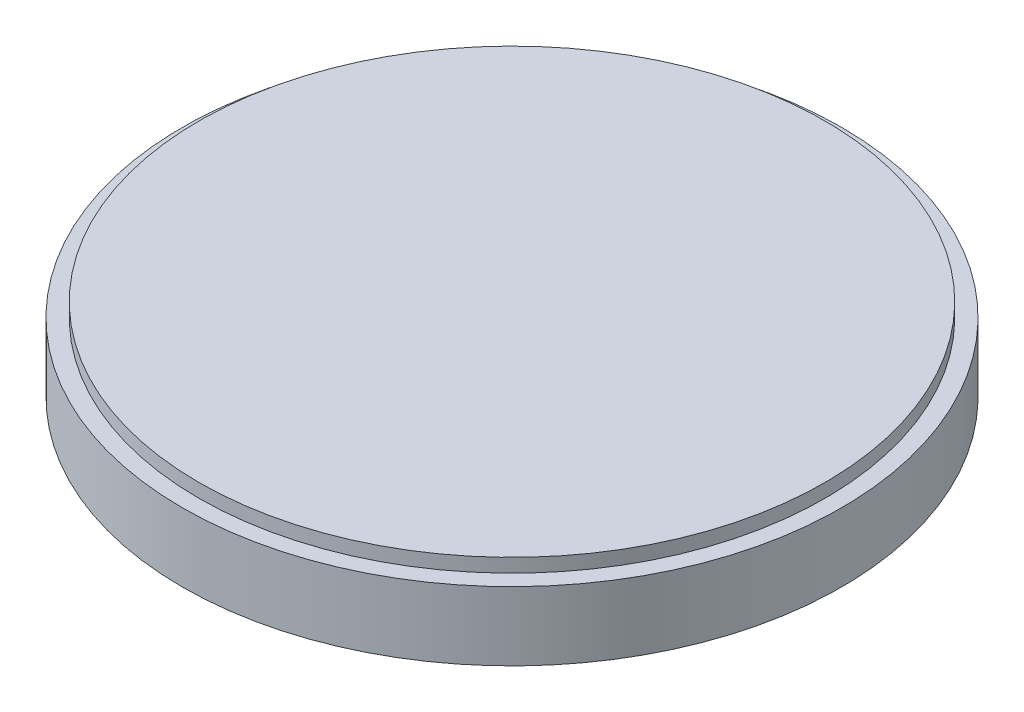
ISO-10303-21;
HEADER;
FILE_DESCRIPTION(('STEP AP214'),'2;1');
FILE_NAME('part.step','',(''),(''),'','','');
FILE_SCHEMA(('AUTOMOTIVE_DESIGN { 1 0 10303 214 1 1 1 1 }'));
ENDSEC;
DATA;
#1=APPLICATION_CONTEXT('core data for automotive mechanical design processes');
#2=APPLICATION_PROTOCOL_DEFINITION('international standard','automotive_design',2000,#1);
#3=PRODUCT_CONTEXT('',#1,'mechanical');
#4=PRODUCT('Part','Part','',(#3));
#5=PRODUCT_RELATED_PRODUCT_CATEGORY('part','',(#4));
#6=PRODUCT_DEFINITION_FORMATION('','',#4);
#7=PRODUCT_DEFINITION_CONTEXT('part definition',#1,'design');
#8=PRODUCT_DEFINITION('design','',#6,#7);
#9=PRODUCT_DEFINITION_SHAPE('','',#8);
#10=(LENGTH_UNIT() NAMED_UNIT(*) SI_UNIT(.MILLI.,.METRE.));
#11=(NAMED_UNIT(*) PLANE_ANGLE_UNIT() SI_UNIT($,.RADIAN.));
#12=(NAMED_UNIT(*) SI_UNIT($,.STERADIAN.) SOLID_ANGLE_UNIT());
#13=UNCERTAINTY_MEASURE_WITH_UNIT(LENGTH_MEASURE(1.E-05),#10,'distance_accuracy_value','');
#14=(GEOMETRIC_REPRESENTATION_CONTEXT(3) GLOBAL_UNCERTAINTY_ASSIGNED_CONTEXT((#13)) GLOBAL_UNIT_ASSIGNED_CONTEXT((#10,
#11,#12)) REPRESENTATION_CONTEXT('',''));
#15=CARTESIAN_POINT('',(0.,0.,0.));
#16=DIRECTION('',(0.,0.,1.));
#17=DIRECTION('',(1.,0.,0.));
#18=AXIS2_PLACEMENT_3D('',#15,#16,#17);
#19=CARTESIAN_POINT('',(0.,7.5,0.));
#20=DIRECTION('',(0.,-1.,0.));
#21=DIRECTION('',(0.,0.,-1.));
#22=AXIS2_PLACEMENT_3D('',#19,#20,#21);
#23=CYLINDRICAL_SURFACE('',#22,57.);
#24=CARTESIAN_POINT('',(0.,5.,0.));
#25=DIRECTION('',(0.,1.,0.));
#26=DIRECTION('',(0.,0.,1.));
#27=AXIS2_PLACEMENT_3D('',#24,#25,#26);
#28=CIRCLE('',#27,57.);
#29=CARTESIAN_POINT('',(0.,5.,57.));
#30=VERTEX_POINT('',#29);
#31=EDGE_CURVE('E41',#30,#30,#28,.T.);
#32=ORIENTED_EDGE('',*,*,#31,.T.);
#33=EDGE_LOOP('',(#32));
#34=FACE_BOUND('',#33,.T.);
#35=CARTESIAN_POINT('',(0.,7.5,0.));
#36=DIRECTION('',(0.,1.,0.));
#37=DIRECTION('',(0.,0.,1.));
#38=AXIS2_PLACEMENT_3D('',#35,#36,#37);
#39=CIRCLE('',#38,57.);
#40=CARTESIAN_POINT('',(0.,7.5,57.));
#41=VERTEX_POINT('',#40);
#42=EDGE_CURVE('E10',#41,#41,#39,.T.);
#43=ORIENTED_EDGE('',*,*,#42,.F.);
#44=EDGE_LOOP('',(#43));
#45=FACE_BOUND('',#44,.T.);
#46=ADVANCED_FACE('F31',(#34,#45),#23,.T.);
#47=CARTESIAN_POINT('',(0.,7.5,0.));
#48=DIRECTION('',(0.,1.,0.));
#49=DIRECTION('',(0.,0.,1.));
#50=AXIS2_PLACEMENT_3D('',#47,#48,#49);
#51=PLANE('',#50);
#52=ORIENTED_EDGE('',*,*,#42,.T.);
#53=EDGE_LOOP('',(#52));
#54=FACE_BOUND('',#53,.T.);
#55=ADVANCED_FACE('F62',(#54),#51,.T.);
#56=CARTESIAN_POINT('',(0.,5.,0.));
#57=DIRECTION('',(0.,1.,0.));
#58=DIRECTION('',(0.,0.,1.));
#59=AXIS2_PLACEMENT_3D('',#56,#57,#58);
#60=PLANE('',#59);
#61=CARTESIAN_POINT('',(0.,5.,0.));
#62=DIRECTION('',(0.,1.,0.));
#63=DIRECTION('',(0.,0.,1.));
#64=AXIS2_PLACEMENT_3D('',#61,#62,#63);
#65=CIRCLE('',#64,60.);
#66=CARTESIAN_POINT('',(0.,5.,60.));
#67=VERTEX_POINT('',#66);
#68=EDGE_CURVE('E37',#67,#67,#65,.T.);
#69=ORIENTED_EDGE('',*,*,#68,.T.);
#70=EDGE_LOOP('',(#69));
#71=FACE_BOUND('',#70,.T.);
#72=ORIENTED_EDGE('',*,*,#31,.F.);
#73=EDGE_LOOP('',(#72));
#74=FACE_BOUND('',#73,.T.);
#75=ADVANCED_FACE('F55',(#71,#74),#60,.T.);
#76=CARTESIAN_POINT('',(0.,5.,0.));
#77=DIRECTION('',(0.,-1.,0.));
#78=DIRECTION('',(0.,0.,-1.));
#79=AXIS2_PLACEMENT_3D('',#76,#77,#78);
#80=CYLINDRICAL_SURFACE('',#79,60.);
#81=ORIENTED_EDGE('',*,*,#68,.F.);
#82=EDGE_LOOP('',(#81));
#83=FACE_BOUND('',#82,.T.);
#84=CARTESIAN_POINT('',(0.,-7.50000000000001,0.));
#85=DIRECTION('',(0.,1.,0.));
#86=DIRECTION('',(0.,0.,1.));
#87=AXIS2_PLACEMENT_3D('',#84,#85,#86);
#88=CIRCLE('',#87,60.);
#89=CARTESIAN_POINT('',(0.,-7.50000000000001,60.));
#90=VERTEX_POINT('',#89);
#91=EDGE_CURVE('E45',#90,#90,#88,.F.);
#92=ORIENTED_EDGE('',*,*,#91,.F.);
#93=EDGE_LOOP('',(#92));
#94=FACE_BOUND('',#93,.T.);
#95=ADVANCED_FACE('F53',(#83,#94),#80,.T.);
#96=CARTESIAN_POINT('',(0.,-7.5,0.));
#97=DIRECTION('',(0.,1.,0.));
#98=DIRECTION('',(0.,0.,1.));
#99=AXIS2_PLACEMENT_3D('',#96,#97,#98);
#100=PLANE('',#99);
#101=ORIENTED_EDGE('',*,*,#91,.T.);
#102=EDGE_LOOP('',(#101));
#103=FACE_BOUND('',#102,.T.);
#104=ADVANCED_FACE('F51',(#103),#100,.F.);
#105=CLOSED_SHELL('',(#46,#55,#75,#95,#104));
#106=MANIFOLD_SOLID_BREP('B2',#105);
#107=ADVANCED_BREP_SHAPE_REPRESENTATION('',(#18,#106),#14);
#108=SHAPE_DEFINITION_REPRESENTATION(#9,#107);
ENDSEC;
END-ISO-10303-21;
